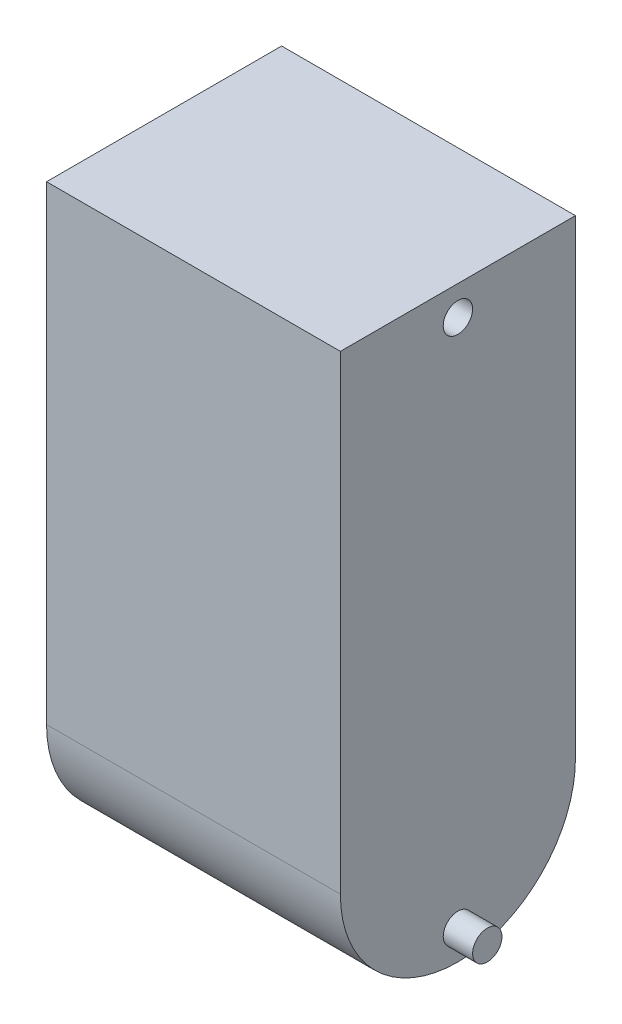
ISO-10303-21;
HEADER;
FILE_DESCRIPTION(('STEP AP214'),'2;1');
FILE_NAME('part.step','',(''),(''),'','','');
FILE_SCHEMA(('AUTOMOTIVE_DESIGN { 1 0 10303 214 1 1 1 1 }'));
ENDSEC;
DATA;
#1=APPLICATION_CONTEXT('core data for automotive mechanical design processes');
#2=APPLICATION_PROTOCOL_DEFINITION('international standard','automotive_design',2000,#1);
#3=PRODUCT_CONTEXT('',#1,'mechanical');
#4=PRODUCT('Part','Part','',(#3));
#5=PRODUCT_RELATED_PRODUCT_CATEGORY('part','',(#4));
#6=PRODUCT_DEFINITION_FORMATION('','',#4);
#7=PRODUCT_DEFINITION_CONTEXT('part definition',#1,'design');
#8=PRODUCT_DEFINITION('design','',#6,#7);
#9=PRODUCT_DEFINITION_SHAPE('','',#8);
#10=(LENGTH_UNIT() NAMED_UNIT(*) SI_UNIT(.MILLI.,.METRE.));
#11=(NAMED_UNIT(*) PLANE_ANGLE_UNIT() SI_UNIT($,.RADIAN.));
#12=(NAMED_UNIT(*) SI_UNIT($,.STERADIAN.) SOLID_ANGLE_UNIT());
#13=UNCERTAINTY_MEASURE_WITH_UNIT(LENGTH_MEASURE(1.E-05),#10,'distance_accuracy_value','');
#14=(GEOMETRIC_REPRESENTATION_CONTEXT(3) GLOBAL_UNCERTAINTY_ASSIGNED_CONTEXT((#13)) GLOBAL_UNIT_ASSIGNED_CONTEXT((#10,
#11,#12)) REPRESENTATION_CONTEXT('',''));
#15=CARTESIAN_POINT('',(0.,0.,0.));
#16=DIRECTION('',(0.,0.,1.));
#17=DIRECTION('',(1.,0.,0.));
#18=AXIS2_PLACEMENT_3D('',#15,#16,#17);
#19=CARTESIAN_POINT('',(0.,101.6,101.6));
#20=DIRECTION('',(1.,0.,0.));
#21=DIRECTION('',(0.,0.,-1.));
#22=AXIS2_PLACEMENT_3D('',#19,#20,#21);
#23=CYLINDRICAL_SURFACE('',#22,101.6);
#24=DIRECTION('',(1.,0.,0.));
#25=VECTOR('',#24,1.);
#26=CARTESIAN_POINT('',(0.,101.6,203.2));
#27=LINE('',#26,#25);
#28=CARTESIAN_POINT('',(0.,101.6,203.2));
#29=VERTEX_POINT('',#28);
#30=CARTESIAN_POINT('',(254.,101.6,203.2));
#31=VERTEX_POINT('',#30);
#32=EDGE_CURVE('E85',#29,#31,#27,.T.);
#33=ORIENTED_EDGE('',*,*,#32,.F.);
#34=CARTESIAN_POINT('',(0.,101.6,101.6));
#35=DIRECTION('',(1.,0.,0.));
#36=DIRECTION('',(0.,0.,-1.));
#37=AXIS2_PLACEMENT_3D('',#34,#35,#36);
#38=CIRCLE('',#37,101.6);
#39=CARTESIAN_POINT('',(0.,101.6,0.));
#40=VERTEX_POINT('',#39);
#41=EDGE_CURVE('E48',#40,#29,#38,.F.);
#42=ORIENTED_EDGE('',*,*,#41,.F.);
#43=DIRECTION('',(-1.,0.,0.));
#44=VECTOR('',#43,1.);
#45=CARTESIAN_POINT('',(0.,101.6,0.));
#46=LINE('',#45,#44);
#47=CARTESIAN_POINT('',(254.,101.6,0.));
#48=VERTEX_POINT('',#47);
#49=EDGE_CURVE('E112',#48,#40,#46,.T.);
#50=ORIENTED_EDGE('',*,*,#49,.F.);
#51=CARTESIAN_POINT('',(254.,101.6,101.6));
#52=DIRECTION('',(-1.,0.,0.));
#53=DIRECTION('',(0.,0.,1.));
#54=AXIS2_PLACEMENT_3D('',#51,#52,#53);
#55=CIRCLE('',#54,101.6);
#56=EDGE_CURVE('E12',#31,#48,#55,.F.);
#57=ORIENTED_EDGE('',*,*,#56,.F.);
#58=EDGE_LOOP('',(#33,#42,#50,#57));
#59=FACE_BOUND('',#58,.T.);
#60=ADVANCED_FACE('F39',(#59),#23,.T.);
#61=CARTESIAN_POINT('',(0.,0.,203.2));
#62=DIRECTION('',(1.,0.,0.));
#63=DIRECTION('',(0.,0.,-1.));
#64=AXIS2_PLACEMENT_3D('',#61,#62,#63);
#65=PLANE('',#64);
#66=CARTESIAN_POINT('',(0.,482.6,101.6));
#67=DIRECTION('',(1.,0.,0.));
#68=DIRECTION('',(0.,0.,-1.));
#69=AXIS2_PLACEMENT_3D('',#66,#67,#68);
#70=CIRCLE('',#69,12.7);
#71=CARTESIAN_POINT('',(0.,482.6,88.8999999999999));
#72=VERTEX_POINT('',#71);
#73=EDGE_CURVE('E127',#72,#72,#70,.F.);
#74=ORIENTED_EDGE('',*,*,#73,.F.);
#75=EDGE_LOOP('',(#74));
#76=FACE_BOUND('',#75,.T.);
#77=CARTESIAN_POINT('',(0.,25.4,101.6));
#78=DIRECTION('',(1.,0.,0.));
#79=DIRECTION('',(0.,0.,-1.));
#80=AXIS2_PLACEMENT_3D('',#77,#78,#79);
#81=CIRCLE('',#80,12.7);
#82=CARTESIAN_POINT('',(0.,25.4,88.8999999999998));
#83=VERTEX_POINT('',#82);
#84=EDGE_CURVE('E107',#83,#83,#81,.T.);
#85=ORIENTED_EDGE('',*,*,#84,.T.);
#86=EDGE_LOOP('',(#85));
#87=FACE_BOUND('',#86,.T.);
#88=DIRECTION('',(0.,-1.,0.));
#89=VECTOR('',#88,1.);
#90=CARTESIAN_POINT('',(0.,0.,0.));
#91=LINE('',#90,#89);
#92=CARTESIAN_POINT('',(0.,508.,0.));
#93=VERTEX_POINT('',#92);
#94=EDGE_CURVE('E104',#93,#40,#91,.T.);
#95=ORIENTED_EDGE('',*,*,#94,.T.);
#96=ORIENTED_EDGE('',*,*,#41,.T.);
#97=DIRECTION('',(0.,-1.,0.));
#98=VECTOR('',#97,1.);
#99=CARTESIAN_POINT('',(0.,0.,203.2));
#100=LINE('',#99,#98);
#101=CARTESIAN_POINT('',(0.,508.,203.2));
#102=VERTEX_POINT('',#101);
#103=EDGE_CURVE('E86',#102,#29,#100,.T.);
#104=ORIENTED_EDGE('',*,*,#103,.F.);
#105=DIRECTION('',(0.,0.,-1.));
#106=VECTOR('',#105,1.);
#107=CARTESIAN_POINT('',(0.,508.,203.2));
#108=LINE('',#107,#106);
#109=EDGE_CURVE('E95',#102,#93,#108,.T.);
#110=ORIENTED_EDGE('',*,*,#109,.T.);
#111=EDGE_LOOP('',(#95,#96,#104,#110));
#112=FACE_BOUND('',#111,.T.);
#113=ADVANCED_FACE('F131',(#76,#87,#112),#65,.F.);
#114=CARTESIAN_POINT('',(254.,0.,203.2));
#115=DIRECTION('',(-1.,0.,0.));
#116=DIRECTION('',(0.,0.,1.));
#117=AXIS2_PLACEMENT_3D('',#114,#115,#116);
#118=PLANE('',#117);
#119=CARTESIAN_POINT('',(254.,482.6,101.6));
#120=DIRECTION('',(-1.,0.,0.));
#121=DIRECTION('',(0.,0.,1.));
#122=AXIS2_PLACEMENT_3D('',#119,#120,#121);
#123=CIRCLE('',#122,12.7);
#124=CARTESIAN_POINT('',(254.,482.6,114.3));
#125=VERTEX_POINT('',#124);
#126=EDGE_CURVE('E43',#125,#125,#123,.F.);
#127=ORIENTED_EDGE('',*,*,#126,.F.);
#128=EDGE_LOOP('',(#127));
#129=FACE_BOUND('',#128,.T.);
#130=CARTESIAN_POINT('',(254.,25.4,101.6));
#131=DIRECTION('',(-1.,0.,0.));
#132=DIRECTION('',(0.,0.,1.));
#133=AXIS2_PLACEMENT_3D('',#130,#131,#132);
#134=CIRCLE('',#133,12.7);
#135=CARTESIAN_POINT('',(254.,25.4,114.3));
#136=VERTEX_POINT('',#135);
#137=EDGE_CURVE('E114',#136,#136,#134,.T.);
#138=ORIENTED_EDGE('',*,*,#137,.T.);
#139=EDGE_LOOP('',(#138));
#140=FACE_BOUND('',#139,.T.);
#141=DIRECTION('',(0.,1.,0.));
#142=VECTOR('',#141,1.);
#143=CARTESIAN_POINT('',(254.,0.,203.2));
#144=LINE('',#143,#142);
#145=CARTESIAN_POINT('',(254.,508.,203.2));
#146=VERTEX_POINT('',#145);
#147=EDGE_CURVE('E78',#31,#146,#144,.T.);
#148=ORIENTED_EDGE('',*,*,#147,.F.);
#149=ORIENTED_EDGE('',*,*,#56,.T.);
#150=DIRECTION('',(0.,1.,0.));
#151=VECTOR('',#150,1.);
#152=CARTESIAN_POINT('',(254.,0.,0.));
#153=LINE('',#152,#151);
#154=CARTESIAN_POINT('',(254.,508.,0.));
#155=VERTEX_POINT('',#154);
#156=EDGE_CURVE('E92',#48,#155,#153,.T.);
#157=ORIENTED_EDGE('',*,*,#156,.T.);
#158=DIRECTION('',(0.,0.,-1.));
#159=VECTOR('',#158,1.);
#160=CARTESIAN_POINT('',(254.,508.,203.2));
#161=LINE('',#160,#159);
#162=EDGE_CURVE('E89',#146,#155,#161,.T.);
#163=ORIENTED_EDGE('',*,*,#162,.F.);
#164=EDGE_LOOP('',(#148,#149,#157,#163));
#165=FACE_BOUND('',#164,.T.);
#166=ADVANCED_FACE('F90',(#129,#140,#165),#118,.F.);
#167=CARTESIAN_POINT('',(0.,508.,203.2));
#168=DIRECTION('',(0.,-1.,0.));
#169=DIRECTION('',(0.,0.,-1.));
#170=AXIS2_PLACEMENT_3D('',#167,#168,#169);
#171=PLANE('',#170);
#172=DIRECTION('',(-1.,0.,0.));
#173=VECTOR('',#172,1.);
#174=CARTESIAN_POINT('',(0.,508.,0.));
#175=LINE('',#174,#173);
#176=EDGE_CURVE('E109',#155,#93,#175,.T.);
#177=ORIENTED_EDGE('',*,*,#176,.T.);
#178=ORIENTED_EDGE('',*,*,#109,.F.);
#179=DIRECTION('',(-1.,0.,0.));
#180=VECTOR('',#179,1.);
#181=CARTESIAN_POINT('',(0.,508.,203.2));
#182=LINE('',#181,#180);
#183=EDGE_CURVE('E83',#146,#102,#182,.T.);
#184=ORIENTED_EDGE('',*,*,#183,.F.);
#185=ORIENTED_EDGE('',*,*,#162,.T.);
#186=EDGE_LOOP('',(#177,#178,#184,#185));
#187=FACE_BOUND('',#186,.T.);
#188=ADVANCED_FACE('F97',(#187),#171,.F.);
#189=CARTESIAN_POINT('',(0.,0.,203.2));
#190=DIRECTION('',(0.,0.,-1.));
#191=DIRECTION('',(-1.,0.,0.));
#192=AXIS2_PLACEMENT_3D('',#189,#190,#191);
#193=PLANE('',#192);
#194=ORIENTED_EDGE('',*,*,#103,.T.);
#195=ORIENTED_EDGE('',*,*,#32,.T.);
#196=ORIENTED_EDGE('',*,*,#147,.T.);
#197=ORIENTED_EDGE('',*,*,#183,.T.);
#198=EDGE_LOOP('',(#194,#195,#196,#197));
#199=FACE_BOUND('',#198,.T.);
#200=ADVANCED_FACE('F81',(#199),#193,.F.);
#201=CARTESIAN_POINT('',(0.,0.,0.));
#202=DIRECTION('',(0.,0.,-1.));
#203=DIRECTION('',(-1.,0.,0.));
#204=AXIS2_PLACEMENT_3D('',#201,#202,#203);
#205=PLANE('',#204);
#206=ORIENTED_EDGE('',*,*,#156,.F.);
#207=ORIENTED_EDGE('',*,*,#49,.T.);
#208=ORIENTED_EDGE('',*,*,#94,.F.);
#209=ORIENTED_EDGE('',*,*,#176,.F.);
#210=EDGE_LOOP('',(#206,#207,#208,#209));
#211=FACE_BOUND('',#210,.T.);
#212=ADVANCED_FACE('F134',(#211),#205,.T.);
#213=CARTESIAN_POINT('',(279.4,25.4,101.6));
#214=DIRECTION('',(1.,0.,0.));
#215=DIRECTION('',(0.,0.,-1.));
#216=AXIS2_PLACEMENT_3D('',#213,#214,#215);
#217=PLANE('',#216);
#218=CARTESIAN_POINT('',(279.4,25.4,101.6));
#219=DIRECTION('',(1.,0.,0.));
#220=DIRECTION('',(0.,0.,-1.));
#221=AXIS2_PLACEMENT_3D('',#218,#219,#220);
#222=CIRCLE('',#221,12.7);
#223=CARTESIAN_POINT('',(279.4,25.4,88.8999999999998));
#224=VERTEX_POINT('',#223);
#225=EDGE_CURVE('E122',#224,#224,#222,.T.);
#226=ORIENTED_EDGE('',*,*,#225,.T.);
#227=EDGE_LOOP('',(#226));
#228=FACE_BOUND('',#227,.T.);
#229=ADVANCED_FACE('F136',(#228),#217,.T.);
#230=CARTESIAN_POINT('',(-86.7210244842765,25.4,101.6));
#231=DIRECTION('',(1.,0.,0.));
#232=DIRECTION('',(0.,0.,-1.));
#233=AXIS2_PLACEMENT_3D('',#230,#231,#232);
#234=CYLINDRICAL_SURFACE('',#233,12.7);
#235=ORIENTED_EDGE('',*,*,#225,.F.);
#236=EDGE_LOOP('',(#235));
#237=FACE_BOUND('',#236,.T.);
#238=ORIENTED_EDGE('',*,*,#137,.F.);
#239=EDGE_LOOP('',(#238));
#240=FACE_BOUND('',#239,.T.);
#241=ADVANCED_FACE('F142',(#237,#240),#234,.T.);
#242=CARTESIAN_POINT('',(-25.4,25.4,101.6));
#243=DIRECTION('',(1.,0.,0.));
#244=DIRECTION('',(0.,0.,-1.));
#245=AXIS2_PLACEMENT_3D('',#242,#243,#244);
#246=CIRCLE('',#245,12.7);
#247=CARTESIAN_POINT('',(-25.4,25.4,88.8999999999998));
#248=VERTEX_POINT('',#247);
#249=EDGE_CURVE('E116',#248,#248,#246,.F.);
#250=ORIENTED_EDGE('',*,*,#249,.F.);
#251=EDGE_LOOP('',(#250));
#252=FACE_BOUND('',#251,.T.);
#253=ORIENTED_EDGE('',*,*,#84,.F.);
#254=EDGE_LOOP('',(#253));
#255=FACE_BOUND('',#254,.T.);
#256=ADVANCED_FACE('F189',(#252,#255),#234,.T.);
#257=CARTESIAN_POINT('',(-25.4,0.,203.2));
#258=DIRECTION('',(1.,0.,0.));
#259=DIRECTION('',(0.,0.,-1.));
#260=AXIS2_PLACEMENT_3D('',#257,#258,#259);
#261=PLANE('',#260);
#262=ORIENTED_EDGE('',*,*,#249,.T.);
#263=EDGE_LOOP('',(#262));
#264=FACE_BOUND('',#263,.T.);
#265=ADVANCED_FACE('F199',(#264),#261,.F.);
#266=CARTESIAN_POINT('',(449.834,482.6,101.6));
#267=DIRECTION('',(-1.,0.,0.));
#268=DIRECTION('',(0.,0.,1.));
#269=AXIS2_PLACEMENT_3D('',#266,#267,#268);
#270=CYLINDRICAL_SURFACE('',#269,12.7);
#271=ORIENTED_EDGE('',*,*,#126,.T.);
#272=EDGE_LOOP('',(#271));
#273=FACE_BOUND('',#272,.T.);
#274=ORIENTED_EDGE('',*,*,#73,.T.);
#275=EDGE_LOOP('',(#274));
#276=FACE_BOUND('',#275,.T.);
#277=ADVANCED_FACE('F207',(#273,#276),#270,.F.);
#278=CLOSED_SHELL('',(#60,#113,#166,#188,#200,#212,#229,#241,#256,#265,#277));
#279=MANIFOLD_SOLID_BREP('B2',#278);
#280=ADVANCED_BREP_SHAPE_REPRESENTATION('',(#18,#279),#14);
#281=SHAPE_DEFINITION_REPRESENTATION(#9,#280);
ENDSEC;
END-ISO-10303-21;
